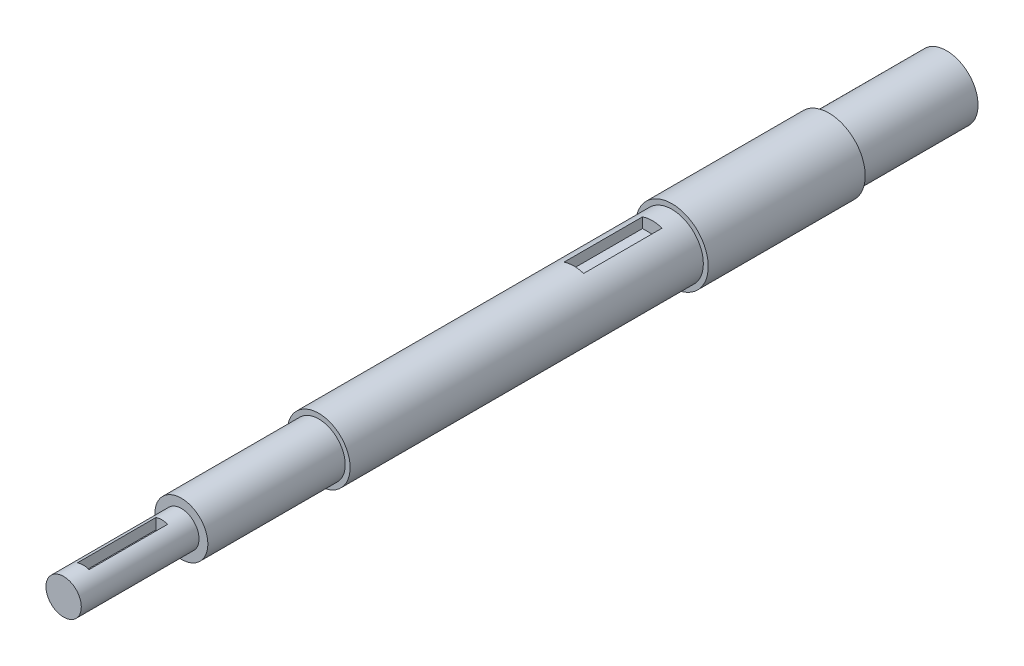
ISO-10303-21;
HEADER;
FILE_DESCRIPTION(('STEP AP214'),'2;1');
FILE_NAME('part.step','',(''),(''),'','','');
FILE_SCHEMA(('AUTOMOTIVE_DESIGN { 1 0 10303 214 1 1 1 1 }'));
ENDSEC;
DATA;
#1=APPLICATION_CONTEXT('core data for automotive mechanical design processes');
#2=APPLICATION_PROTOCOL_DEFINITION('international standard','automotive_design',2000,#1);
#3=PRODUCT_CONTEXT('',#1,'mechanical');
#4=PRODUCT('Part','Part','',(#3));
#5=PRODUCT_RELATED_PRODUCT_CATEGORY('part','',(#4));
#6=PRODUCT_DEFINITION_FORMATION('','',#4);
#7=PRODUCT_DEFINITION_CONTEXT('part definition',#1,'design');
#8=PRODUCT_DEFINITION('design','',#6,#7);
#9=PRODUCT_DEFINITION_SHAPE('','',#8);
#10=(LENGTH_UNIT() NAMED_UNIT(*) SI_UNIT(.MILLI.,.METRE.));
#11=(NAMED_UNIT(*) PLANE_ANGLE_UNIT() SI_UNIT($,.RADIAN.));
#12=(NAMED_UNIT(*) SI_UNIT($,.STERADIAN.) SOLID_ANGLE_UNIT());
#13=UNCERTAINTY_MEASURE_WITH_UNIT(LENGTH_MEASURE(1.E-05),#10,'distance_accuracy_value','');
#14=(GEOMETRIC_REPRESENTATION_CONTEXT(3) GLOBAL_UNCERTAINTY_ASSIGNED_CONTEXT((#13)) GLOBAL_UNIT_ASSIGNED_CONTEXT((#10,
#11,#12)) REPRESENTATION_CONTEXT('',''));
#15=CARTESIAN_POINT('',(0.,0.,0.));
#16=DIRECTION('',(0.,0.,1.));
#17=DIRECTION('',(1.,0.,0.));
#18=AXIS2_PLACEMENT_3D('',#15,#16,#17);
#19=CARTESIAN_POINT('',(0.,0.,130.));
#20=DIRECTION('',(0.,0.,-1.));
#21=DIRECTION('',(-1.,0.,0.));
#22=AXIS2_PLACEMENT_3D('',#19,#20,#21);
#23=CYLINDRICAL_SURFACE('',#22,8.);
#24=CARTESIAN_POINT('',(0.,0.,40.));
#25=DIRECTION('',(0.,0.,1.));
#26=DIRECTION('',(1.,0.,0.));
#27=AXIS2_PLACEMENT_3D('',#24,#25,#26);
#28=CIRCLE('',#27,8.);
#29=CARTESIAN_POINT('',(8.,0.,40.));
#30=VERTEX_POINT('',#29);
#31=EDGE_CURVE('E199',#30,#30,#28,.T.);
#32=ORIENTED_EDGE('',*,*,#31,.T.);
#33=EDGE_LOOP('',(#32));
#34=FACE_BOUND('',#33,.T.);
#35=CARTESIAN_POINT('',(0.,0.,130.));
#36=DIRECTION('',(0.,0.,1.));
#37=DIRECTION('',(1.,0.,0.));
#38=AXIS2_PLACEMENT_3D('',#35,#36,#37);
#39=CIRCLE('',#38,8.);
#40=CARTESIAN_POINT('',(8.,0.,130.));
#41=VERTEX_POINT('',#40);
#42=EDGE_CURVE('E195',#41,#41,#39,.T.);
#43=ORIENTED_EDGE('',*,*,#42,.F.);
#44=EDGE_LOOP('',(#43));
#45=FACE_BOUND('',#44,.T.);
#46=CARTESIAN_POINT('',(0.,0.,45.));
#47=DIRECTION('',(0.,0.,1.));
#48=DIRECTION('',(1.,0.,0.));
#49=AXIS2_PLACEMENT_3D('',#46,#47,#48);
#50=CIRCLE('',#49,8.);
#51=CARTESIAN_POINT('',(2.5,7.59934207678533,45.));
#52=VERTEX_POINT('',#51);
#53=CARTESIAN_POINT('',(-2.5,7.59934207678533,45.));
#54=VERTEX_POINT('',#53);
#55=EDGE_CURVE('E11',#52,#54,#50,.T.);
#56=ORIENTED_EDGE('',*,*,#55,.F.);
#57=DIRECTION('',(0.,0.,-1.));
#58=VECTOR('',#57,1.);
#59=CARTESIAN_POINT('',(2.5,7.59934207678533,130.));
#60=LINE('',#59,#58);
#61=CARTESIAN_POINT('',(2.5,7.59934207678533,65.));
#62=VERTEX_POINT('',#61);
#63=EDGE_CURVE('E52',#52,#62,#60,.F.);
#64=ORIENTED_EDGE('',*,*,#63,.T.);
#65=CARTESIAN_POINT('',(0.,0.,65.));
#66=DIRECTION('',(0.,0.,1.));
#67=DIRECTION('',(1.,0.,0.));
#68=AXIS2_PLACEMENT_3D('',#65,#66,#67);
#69=CIRCLE('',#68,8.);
#70=CARTESIAN_POINT('',(-2.5,7.59934207678533,65.));
#71=VERTEX_POINT('',#70);
#72=EDGE_CURVE('E228',#62,#71,#69,.T.);
#73=ORIENTED_EDGE('',*,*,#72,.T.);
#74=DIRECTION('',(0.,0.,-1.));
#75=VECTOR('',#74,1.);
#76=CARTESIAN_POINT('',(-2.5,7.59934207678533,130.));
#77=LINE('',#76,#75);
#78=EDGE_CURVE('E232',#71,#54,#77,.T.);
#79=ORIENTED_EDGE('',*,*,#78,.T.);
#80=EDGE_LOOP('',(#56,#64,#73,#79));
#81=FACE_BOUND('',#80,.T.);
#82=ADVANCED_FACE('F43',(#34,#45,#81),#23,.T.);
#83=CARTESIAN_POINT('',(0.,0.,195.));
#84=DIRECTION('',(0.,0.,-1.));
#85=DIRECTION('',(-1.,0.,0.));
#86=AXIS2_PLACEMENT_3D('',#83,#84,#85);
#87=CYLINDRICAL_SURFACE('',#86,4.5);
#88=CARTESIAN_POINT('',(0.,0.,165.));
#89=DIRECTION('',(0.,0.,1.));
#90=DIRECTION('',(1.,0.,0.));
#91=AXIS2_PLACEMENT_3D('',#88,#89,#90);
#92=CIRCLE('',#91,4.5);
#93=CARTESIAN_POINT('',(4.5,0.,165.));
#94=VERTEX_POINT('',#93);
#95=EDGE_CURVE('E178',#94,#94,#92,.T.);
#96=ORIENTED_EDGE('',*,*,#95,.T.);
#97=EDGE_LOOP('',(#96));
#98=FACE_BOUND('',#97,.T.);
#99=CARTESIAN_POINT('',(0.,0.,195.));
#100=DIRECTION('',(0.,0.,1.));
#101=DIRECTION('',(1.,0.,0.));
#102=AXIS2_PLACEMENT_3D('',#99,#100,#101);
#103=CIRCLE('',#102,4.5);
#104=CARTESIAN_POINT('',(4.5,0.,195.));
#105=VERTEX_POINT('',#104);
#106=EDGE_CURVE('E170',#105,#105,#103,.T.);
#107=ORIENTED_EDGE('',*,*,#106,.F.);
#108=EDGE_LOOP('',(#107));
#109=FACE_BOUND('',#108,.T.);
#110=CARTESIAN_POINT('',(0.,0.,170.));
#111=DIRECTION('',(0.,0.,1.));
#112=DIRECTION('',(1.,0.,0.));
#113=AXIS2_PLACEMENT_3D('',#110,#111,#112);
#114=CIRCLE('',#113,4.5);
#115=CARTESIAN_POINT('',(1.5,4.24264068711928,170.));
#116=VERTEX_POINT('',#115);
#117=CARTESIAN_POINT('',(-1.5,4.24264068711928,170.));
#118=VERTEX_POINT('',#117);
#119=EDGE_CURVE('E225',#116,#118,#114,.T.);
#120=ORIENTED_EDGE('',*,*,#119,.F.);
#121=DIRECTION('',(0.,0.,-1.));
#122=VECTOR('',#121,1.);
#123=CARTESIAN_POINT('',(1.5,4.24264068711928,195.));
#124=LINE('',#123,#122);
#125=CARTESIAN_POINT('',(1.5,4.24264068711928,190.));
#126=VERTEX_POINT('',#125);
#127=EDGE_CURVE('E221',#116,#126,#124,.F.);
#128=ORIENTED_EDGE('',*,*,#127,.T.);
#129=CARTESIAN_POINT('',(0.,0.,190.));
#130=DIRECTION('',(0.,0.,1.));
#131=DIRECTION('',(1.,0.,0.));
#132=AXIS2_PLACEMENT_3D('',#129,#130,#131);
#133=CIRCLE('',#132,4.5);
#134=CARTESIAN_POINT('',(-1.5,4.24264068711928,190.));
#135=VERTEX_POINT('',#134);
#136=EDGE_CURVE('E182',#126,#135,#133,.T.);
#137=ORIENTED_EDGE('',*,*,#136,.T.);
#138=DIRECTION('',(0.,0.,-1.));
#139=VECTOR('',#138,1.);
#140=CARTESIAN_POINT('',(-1.5,4.24264068711928,195.));
#141=LINE('',#140,#139);
#142=EDGE_CURVE('E217',#135,#118,#141,.T.);
#143=ORIENTED_EDGE('',*,*,#142,.T.);
#144=EDGE_LOOP('',(#120,#128,#137,#143));
#145=FACE_BOUND('',#144,.T.);
#146=ADVANCED_FACE('F251',(#98,#109,#145),#87,.T.);
#147=CARTESIAN_POINT('',(0.,0.,40.));
#148=DIRECTION('',(0.,0.,-1.));
#149=DIRECTION('',(-1.,0.,0.));
#150=AXIS2_PLACEMENT_3D('',#147,#148,#149);
#151=CYLINDRICAL_SURFACE('',#150,9.25);
#152=CARTESIAN_POINT('',(0.,0.,40.));
#153=DIRECTION('',(0.,0.,1.));
#154=DIRECTION('',(1.,0.,0.));
#155=AXIS2_PLACEMENT_3D('',#152,#153,#154);
#156=CIRCLE('',#155,9.25);
#157=CARTESIAN_POINT('',(9.25,0.,40.));
#158=VERTEX_POINT('',#157);
#159=EDGE_CURVE('E207',#158,#158,#156,.T.);
#160=ORIENTED_EDGE('',*,*,#159,.F.);
#161=EDGE_LOOP('',(#160));
#162=FACE_BOUND('',#161,.T.);
#163=CARTESIAN_POINT('',(0.,0.,0.));
#164=DIRECTION('',(0.,0.,1.));
#165=DIRECTION('',(1.,0.,0.));
#166=AXIS2_PLACEMENT_3D('',#163,#164,#165);
#167=CIRCLE('',#166,9.25);
#168=CARTESIAN_POINT('',(9.25,0.,0.));
#169=VERTEX_POINT('',#168);
#170=EDGE_CURVE('E203',#169,#169,#167,.T.);
#171=ORIENTED_EDGE('',*,*,#170,.T.);
#172=EDGE_LOOP('',(#171));
#173=FACE_BOUND('',#172,.T.);
#174=ADVANCED_FACE('F45',(#162,#173),#151,.T.);
#175=CARTESIAN_POINT('',(0.,0.,40.));
#176=DIRECTION('',(0.,0.,1.));
#177=DIRECTION('',(1.,0.,0.));
#178=AXIS2_PLACEMENT_3D('',#175,#176,#177);
#179=PLANE('',#178);
#180=ORIENTED_EDGE('',*,*,#31,.F.);
#181=EDGE_LOOP('',(#180));
#182=FACE_BOUND('',#181,.T.);
#183=ORIENTED_EDGE('',*,*,#159,.T.);
#184=EDGE_LOOP('',(#183));
#185=FACE_BOUND('',#184,.T.);
#186=ADVANCED_FACE('F264',(#182,#185),#179,.T.);
#187=CARTESIAN_POINT('',(0.,0.,0.));
#188=DIRECTION('',(0.,0.,1.));
#189=DIRECTION('',(1.,0.,0.));
#190=AXIS2_PLACEMENT_3D('',#187,#188,#189);
#191=PLANE('',#190);
#192=CARTESIAN_POINT('',(0.,0.,0.));
#193=DIRECTION('',(0.,0.,-1.));
#194=DIRECTION('',(-1.,0.,0.));
#195=AXIS2_PLACEMENT_3D('',#192,#193,#194);
#196=CIRCLE('',#195,8.);
#197=CARTESIAN_POINT('',(-8.,0.,0.));
#198=VERTEX_POINT('',#197);
#199=EDGE_CURVE('E191',#198,#198,#196,.T.);
#200=ORIENTED_EDGE('',*,*,#199,.F.);
#201=EDGE_LOOP('',(#200));
#202=FACE_BOUND('',#201,.T.);
#203=ORIENTED_EDGE('',*,*,#170,.F.);
#204=EDGE_LOOP('',(#203));
#205=FACE_BOUND('',#204,.T.);
#206=ADVANCED_FACE('F266',(#202,#205),#191,.F.);
#207=CARTESIAN_POINT('',(0.,0.,130.));
#208=DIRECTION('',(0.,0.,1.));
#209=DIRECTION('',(1.,0.,0.));
#210=AXIS2_PLACEMENT_3D('',#207,#208,#209);
#211=PLANE('',#210);
#212=CARTESIAN_POINT('',(0.,0.,130.));
#213=DIRECTION('',(0.,0.,1.));
#214=DIRECTION('',(1.,0.,0.));
#215=AXIS2_PLACEMENT_3D('',#212,#213,#214);
#216=CIRCLE('',#215,6.75);
#217=CARTESIAN_POINT('',(6.75,0.,130.));
#218=VERTEX_POINT('',#217);
#219=EDGE_CURVE('E183',#218,#218,#216,.T.);
#220=ORIENTED_EDGE('',*,*,#219,.F.);
#221=EDGE_LOOP('',(#220));
#222=FACE_BOUND('',#221,.T.);
#223=ORIENTED_EDGE('',*,*,#42,.T.);
#224=EDGE_LOOP('',(#223));
#225=FACE_BOUND('',#224,.T.);
#226=ADVANCED_FACE('F262',(#222,#225),#211,.T.);
#227=CARTESIAN_POINT('',(0.,0.,-30.));
#228=DIRECTION('',(0.,0.,1.));
#229=DIRECTION('',(1.,0.,0.));
#230=AXIS2_PLACEMENT_3D('',#227,#228,#229);
#231=CYLINDRICAL_SURFACE('',#230,8.);
#232=CARTESIAN_POINT('',(0.,0.,-30.));
#233=DIRECTION('',(0.,0.,-1.));
#234=DIRECTION('',(-1.,0.,0.));
#235=AXIS2_PLACEMENT_3D('',#232,#233,#234);
#236=CIRCLE('',#235,8.);
#237=CARTESIAN_POINT('',(-8.,0.,-30.));
#238=VERTEX_POINT('',#237);
#239=EDGE_CURVE('E187',#238,#238,#236,.T.);
#240=ORIENTED_EDGE('',*,*,#239,.F.);
#241=EDGE_LOOP('',(#240));
#242=FACE_BOUND('',#241,.T.);
#243=ORIENTED_EDGE('',*,*,#199,.T.);
#244=EDGE_LOOP('',(#243));
#245=FACE_BOUND('',#244,.T.);
#246=ADVANCED_FACE('F273',(#242,#245),#231,.T.);
#247=CARTESIAN_POINT('',(0.,0.,-30.));
#248=DIRECTION('',(0.,0.,-1.));
#249=DIRECTION('',(-1.,0.,0.));
#250=AXIS2_PLACEMENT_3D('',#247,#248,#249);
#251=PLANE('',#250);
#252=ORIENTED_EDGE('',*,*,#239,.T.);
#253=EDGE_LOOP('',(#252));
#254=FACE_BOUND('',#253,.T.);
#255=ADVANCED_FACE('F307',(#254),#251,.T.);
#256=CARTESIAN_POINT('',(0.,0.,165.));
#257=DIRECTION('',(0.,0.,-1.));
#258=DIRECTION('',(-1.,0.,0.));
#259=AXIS2_PLACEMENT_3D('',#256,#257,#258);
#260=CYLINDRICAL_SURFACE('',#259,6.75);
#261=CARTESIAN_POINT('',(0.,0.,165.));
#262=DIRECTION('',(0.,0.,1.));
#263=DIRECTION('',(1.,0.,0.));
#264=AXIS2_PLACEMENT_3D('',#261,#262,#263);
#265=CIRCLE('',#264,6.75);
#266=CARTESIAN_POINT('',(6.75,0.,165.));
#267=VERTEX_POINT('',#266);
#268=EDGE_CURVE('E177',#267,#267,#265,.T.);
#269=ORIENTED_EDGE('',*,*,#268,.F.);
#270=EDGE_LOOP('',(#269));
#271=FACE_BOUND('',#270,.T.);
#272=ORIENTED_EDGE('',*,*,#219,.T.);
#273=EDGE_LOOP('',(#272));
#274=FACE_BOUND('',#273,.T.);
#275=ADVANCED_FACE('F317',(#271,#274),#260,.T.);
#276=CARTESIAN_POINT('',(0.,0.,165.));
#277=DIRECTION('',(0.,0.,1.));
#278=DIRECTION('',(1.,0.,0.));
#279=AXIS2_PLACEMENT_3D('',#276,#277,#278);
#280=PLANE('',#279);
#281=ORIENTED_EDGE('',*,*,#95,.F.);
#282=EDGE_LOOP('',(#281));
#283=FACE_BOUND('',#282,.T.);
#284=ORIENTED_EDGE('',*,*,#268,.T.);
#285=EDGE_LOOP('',(#284));
#286=FACE_BOUND('',#285,.T.);
#287=ADVANCED_FACE('F334',(#283,#286),#280,.T.);
#288=CARTESIAN_POINT('',(0.,0.,195.));
#289=DIRECTION('',(0.,0.,1.));
#290=DIRECTION('',(1.,0.,0.));
#291=AXIS2_PLACEMENT_3D('',#288,#289,#290);
#292=PLANE('',#291);
#293=ORIENTED_EDGE('',*,*,#106,.T.);
#294=EDGE_LOOP('',(#293));
#295=FACE_BOUND('',#294,.T.);
#296=ADVANCED_FACE('F345',(#295),#292,.T.);
#297=CARTESIAN_POINT('',(1.5,7.5,170.));
#298=DIRECTION('',(1.,0.,0.));
#299=DIRECTION('',(0.,1.,0.));
#300=AXIS2_PLACEMENT_3D('',#297,#298,#299);
#301=PLANE('',#300);
#302=DIRECTION('',(0.,1.,0.));
#303=VECTOR('',#302,1.);
#304=CARTESIAN_POINT('',(1.5,7.5,170.));
#305=LINE('',#304,#303);
#306=CARTESIAN_POINT('',(1.5,1.5,170.));
#307=VERTEX_POINT('',#306);
#308=EDGE_CURVE('E146',#307,#116,#305,.T.);
#309=ORIENTED_EDGE('',*,*,#308,.F.);
#310=DIRECTION('',(0.,0.,1.));
#311=VECTOR('',#310,1.);
#312=CARTESIAN_POINT('',(1.5,1.5,170.));
#313=LINE('',#312,#311);
#314=CARTESIAN_POINT('',(1.5,1.5,190.));
#315=VERTEX_POINT('',#314);
#316=EDGE_CURVE('E167',#307,#315,#313,.T.);
#317=ORIENTED_EDGE('',*,*,#316,.T.);
#318=DIRECTION('',(0.,1.,0.));
#319=VECTOR('',#318,1.);
#320=CARTESIAN_POINT('',(1.5,7.5,190.));
#321=LINE('',#320,#319);
#322=EDGE_CURVE('E144',#315,#126,#321,.T.);
#323=ORIENTED_EDGE('',*,*,#322,.T.);
#324=ORIENTED_EDGE('',*,*,#127,.F.);
#325=EDGE_LOOP('',(#309,#317,#323,#324));
#326=FACE_BOUND('',#325,.T.);
#327=ADVANCED_FACE('F355',(#326),#301,.F.);
#328=CARTESIAN_POINT('',(-1.5,7.5,170.));
#329=DIRECTION('',(-1.,0.,0.));
#330=DIRECTION('',(0.,-1.,0.));
#331=AXIS2_PLACEMENT_3D('',#328,#329,#330);
#332=PLANE('',#331);
#333=DIRECTION('',(0.,-1.,0.));
#334=VECTOR('',#333,1.);
#335=CARTESIAN_POINT('',(-1.5,7.5,190.));
#336=LINE('',#335,#334);
#337=CARTESIAN_POINT('',(-1.5,1.5,190.));
#338=VERTEX_POINT('',#337);
#339=EDGE_CURVE('E67',#135,#338,#336,.T.);
#340=ORIENTED_EDGE('',*,*,#339,.T.);
#341=DIRECTION('',(0.,0.,1.));
#342=VECTOR('',#341,1.);
#343=CARTESIAN_POINT('',(-1.5,1.5,170.));
#344=LINE('',#343,#342);
#345=CARTESIAN_POINT('',(-1.5,1.5,170.));
#346=VERTEX_POINT('',#345);
#347=EDGE_CURVE('E158',#346,#338,#344,.T.);
#348=ORIENTED_EDGE('',*,*,#347,.F.);
#349=DIRECTION('',(0.,-1.,0.));
#350=VECTOR('',#349,1.);
#351=CARTESIAN_POINT('',(-1.5,7.5,170.));
#352=LINE('',#351,#350);
#353=EDGE_CURVE('E150',#118,#346,#352,.T.);
#354=ORIENTED_EDGE('',*,*,#353,.F.);
#355=ORIENTED_EDGE('',*,*,#142,.F.);
#356=EDGE_LOOP('',(#340,#348,#354,#355));
#357=FACE_BOUND('',#356,.T.);
#358=ADVANCED_FACE('F372',(#357),#332,.F.);
#359=CARTESIAN_POINT('',(0.,0.,170.));
#360=DIRECTION('',(0.,0.,1.));
#361=DIRECTION('',(1.,0.,0.));
#362=AXIS2_PLACEMENT_3D('',#359,#360,#361);
#363=PLANE('',#362);
#364=ORIENTED_EDGE('',*,*,#119,.T.);
#365=ORIENTED_EDGE('',*,*,#353,.T.);
#366=DIRECTION('',(1.,0.,0.));
#367=VECTOR('',#366,1.);
#368=CARTESIAN_POINT('',(-1.5,1.5,170.));
#369=LINE('',#368,#367);
#370=EDGE_CURVE('E154',#346,#307,#369,.T.);
#371=ORIENTED_EDGE('',*,*,#370,.T.);
#372=ORIENTED_EDGE('',*,*,#308,.T.);
#373=EDGE_LOOP('',(#364,#365,#371,#372));
#374=FACE_BOUND('',#373,.T.);
#375=ADVANCED_FACE('F382',(#374),#363,.T.);
#376=CARTESIAN_POINT('',(0.,0.,190.));
#377=DIRECTION('',(0.,0.,1.));
#378=DIRECTION('',(1.,0.,0.));
#379=AXIS2_PLACEMENT_3D('',#376,#377,#378);
#380=PLANE('',#379);
#381=ORIENTED_EDGE('',*,*,#322,.F.);
#382=DIRECTION('',(1.,0.,0.));
#383=VECTOR('',#382,1.);
#384=CARTESIAN_POINT('',(-1.5,1.5,190.));
#385=LINE('',#384,#383);
#386=EDGE_CURVE('E151',#338,#315,#385,.T.);
#387=ORIENTED_EDGE('',*,*,#386,.F.);
#388=ORIENTED_EDGE('',*,*,#339,.F.);
#389=ORIENTED_EDGE('',*,*,#136,.F.);
#390=EDGE_LOOP('',(#381,#387,#388,#389));
#391=FACE_BOUND('',#390,.T.);
#392=ADVANCED_FACE('F393',(#391),#380,.F.);
#393=CARTESIAN_POINT('',(-1.5,1.5,170.));
#394=DIRECTION('',(0.,-1.,0.));
#395=DIRECTION('',(0.,0.,-1.));
#396=AXIS2_PLACEMENT_3D('',#393,#394,#395);
#397=PLANE('',#396);
#398=ORIENTED_EDGE('',*,*,#386,.T.);
#399=ORIENTED_EDGE('',*,*,#316,.F.);
#400=ORIENTED_EDGE('',*,*,#370,.F.);
#401=ORIENTED_EDGE('',*,*,#347,.T.);
#402=EDGE_LOOP('',(#398,#399,#400,#401));
#403=FACE_BOUND('',#402,.T.);
#404=ADVANCED_FACE('F404',(#403),#397,.F.);
#405=CARTESIAN_POINT('',(2.5,11.,45.));
#406=DIRECTION('',(1.,0.,0.));
#407=DIRECTION('',(0.,1.,0.));
#408=AXIS2_PLACEMENT_3D('',#405,#406,#407);
#409=PLANE('',#408);
#410=DIRECTION('',(0.,1.,0.));
#411=VECTOR('',#410,1.);
#412=CARTESIAN_POINT('',(2.5,11.,45.));
#413=LINE('',#412,#411);
#414=CARTESIAN_POINT('',(2.5,5.,45.));
#415=VERTEX_POINT('',#414);
#416=EDGE_CURVE('E118',#415,#52,#413,.T.);
#417=ORIENTED_EDGE('',*,*,#416,.F.);
#418=DIRECTION('',(0.,0.,1.));
#419=VECTOR('',#418,1.);
#420=CARTESIAN_POINT('',(2.5,5.,45.));
#421=LINE('',#420,#419);
#422=CARTESIAN_POINT('',(2.5,5.,65.));
#423=VERTEX_POINT('',#422);
#424=EDGE_CURVE('E126',#415,#423,#421,.T.);
#425=ORIENTED_EDGE('',*,*,#424,.T.);
#426=DIRECTION('',(0.,1.,0.));
#427=VECTOR('',#426,1.);
#428=CARTESIAN_POINT('',(2.5,11.,65.));
#429=LINE('',#428,#427);
#430=EDGE_CURVE('E134',#423,#62,#429,.T.);
#431=ORIENTED_EDGE('',*,*,#430,.T.);
#432=ORIENTED_EDGE('',*,*,#63,.F.);
#433=EDGE_LOOP('',(#417,#425,#431,#432));
#434=FACE_BOUND('',#433,.T.);
#435=ADVANCED_FACE('F238',(#434),#409,.F.);
#436=CARTESIAN_POINT('',(-2.5,11.,45.));
#437=DIRECTION('',(-1.,0.,0.));
#438=DIRECTION('',(0.,-1.,0.));
#439=AXIS2_PLACEMENT_3D('',#436,#437,#438);
#440=PLANE('',#439);
#441=DIRECTION('',(0.,-1.,0.));
#442=VECTOR('',#441,1.);
#443=CARTESIAN_POINT('',(-2.5,11.,65.));
#444=LINE('',#443,#442);
#445=CARTESIAN_POINT('',(-2.5,5.,65.));
#446=VERTEX_POINT('',#445);
#447=EDGE_CURVE('E59',#71,#446,#444,.T.);
#448=ORIENTED_EDGE('',*,*,#447,.T.);
#449=DIRECTION('',(0.,0.,1.));
#450=VECTOR('',#449,1.);
#451=CARTESIAN_POINT('',(-2.5,5.,45.));
#452=LINE('',#451,#450);
#453=CARTESIAN_POINT('',(-2.5,5.,45.));
#454=VERTEX_POINT('',#453);
#455=EDGE_CURVE('E121',#454,#446,#452,.T.);
#456=ORIENTED_EDGE('',*,*,#455,.F.);
#457=DIRECTION('',(0.,-1.,0.));
#458=VECTOR('',#457,1.);
#459=CARTESIAN_POINT('',(-2.5,11.,45.));
#460=LINE('',#459,#458);
#461=EDGE_CURVE('E108',#54,#454,#460,.T.);
#462=ORIENTED_EDGE('',*,*,#461,.F.);
#463=ORIENTED_EDGE('',*,*,#78,.F.);
#464=EDGE_LOOP('',(#448,#456,#462,#463));
#465=FACE_BOUND('',#464,.T.);
#466=ADVANCED_FACE('F122',(#465),#440,.F.);
#467=CARTESIAN_POINT('',(0.,0.,45.));
#468=DIRECTION('',(0.,0.,1.));
#469=DIRECTION('',(1.,0.,0.));
#470=AXIS2_PLACEMENT_3D('',#467,#468,#469);
#471=PLANE('',#470);
#472=ORIENTED_EDGE('',*,*,#55,.T.);
#473=ORIENTED_EDGE('',*,*,#461,.T.);
#474=DIRECTION('',(1.,0.,0.));
#475=VECTOR('',#474,1.);
#476=CARTESIAN_POINT('',(-2.5,5.,45.));
#477=LINE('',#476,#475);
#478=EDGE_CURVE('E113',#454,#415,#477,.T.);
#479=ORIENTED_EDGE('',*,*,#478,.T.);
#480=ORIENTED_EDGE('',*,*,#416,.T.);
#481=EDGE_LOOP('',(#472,#473,#479,#480));
#482=FACE_BOUND('',#481,.T.);
#483=ADVANCED_FACE('F110',(#482),#471,.T.);
#484=CARTESIAN_POINT('',(0.,0.,65.));
#485=DIRECTION('',(0.,0.,1.));
#486=DIRECTION('',(1.,0.,0.));
#487=AXIS2_PLACEMENT_3D('',#484,#485,#486);
#488=PLANE('',#487);
#489=ORIENTED_EDGE('',*,*,#430,.F.);
#490=DIRECTION('',(1.,0.,0.));
#491=VECTOR('',#490,1.);
#492=CARTESIAN_POINT('',(-2.5,5.,65.));
#493=LINE('',#492,#491);
#494=EDGE_CURVE('E140',#446,#423,#493,.T.);
#495=ORIENTED_EDGE('',*,*,#494,.F.);
#496=ORIENTED_EDGE('',*,*,#447,.F.);
#497=ORIENTED_EDGE('',*,*,#72,.F.);
#498=EDGE_LOOP('',(#489,#495,#496,#497));
#499=FACE_BOUND('',#498,.T.);
#500=ADVANCED_FACE('F241',(#499),#488,.F.);
#501=CARTESIAN_POINT('',(-2.5,5.,45.));
#502=DIRECTION('',(0.,-1.,0.));
#503=DIRECTION('',(0.,0.,-1.));
#504=AXIS2_PLACEMENT_3D('',#501,#502,#503);
#505=PLANE('',#504);
#506=ORIENTED_EDGE('',*,*,#494,.T.);
#507=ORIENTED_EDGE('',*,*,#424,.F.);
#508=ORIENTED_EDGE('',*,*,#478,.F.);
#509=ORIENTED_EDGE('',*,*,#455,.T.);
#510=EDGE_LOOP('',(#506,#507,#508,#509));
#511=FACE_BOUND('',#510,.T.);
#512=ADVANCED_FACE('F128',(#511),#505,.F.);
#513=CLOSED_SHELL('',(#82,#146,#174,#186,#206,#226,#246,#255,#275,#287,#296,#327,#358,#375,#392,
#404,#435,#466,#483,#500,#512));
#514=MANIFOLD_SOLID_BREP('B2',#513);
#515=ADVANCED_BREP_SHAPE_REPRESENTATION('',(#18,#514),#14);
#516=SHAPE_DEFINITION_REPRESENTATION(#9,#515);
ENDSEC;
END-ISO-10303-21;
